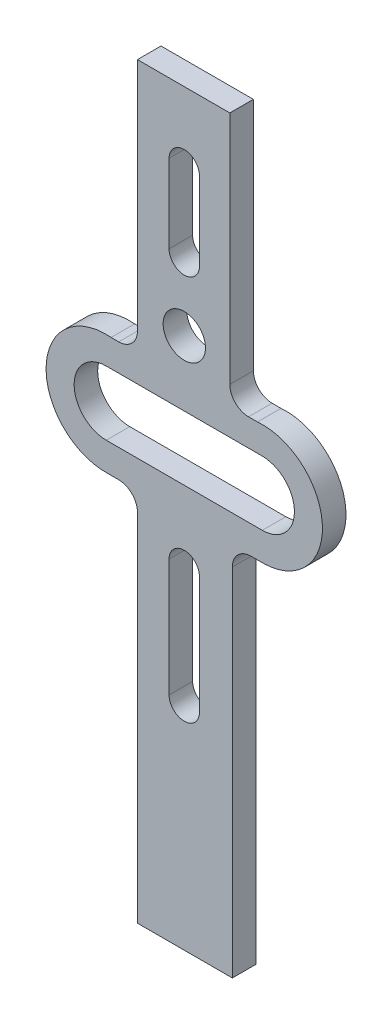
ISO-10303-21;
HEADER;
FILE_DESCRIPTION(('STEP AP214'),'2;1');
FILE_NAME('part.step','',(''),(''),'','','');
FILE_SCHEMA(('AUTOMOTIVE_DESIGN { 1 0 10303 214 1 1 1 1 }'));
ENDSEC;
DATA;
#1=APPLICATION_CONTEXT('core data for automotive mechanical design processes');
#2=APPLICATION_PROTOCOL_DEFINITION('international standard','automotive_design',2000,#1);
#3=PRODUCT_CONTEXT('',#1,'mechanical');
#4=PRODUCT('Part','Part','',(#3));
#5=PRODUCT_RELATED_PRODUCT_CATEGORY('part','',(#4));
#6=PRODUCT_DEFINITION_FORMATION('','',#4);
#7=PRODUCT_DEFINITION_CONTEXT('part definition',#1,'design');
#8=PRODUCT_DEFINITION('design','',#6,#7);
#9=PRODUCT_DEFINITION_SHAPE('','',#8);
#10=(LENGTH_UNIT() NAMED_UNIT(*) SI_UNIT(.MILLI.,.METRE.));
#11=(NAMED_UNIT(*) PLANE_ANGLE_UNIT() SI_UNIT($,.RADIAN.));
#12=(NAMED_UNIT(*) SI_UNIT($,.STERADIAN.) SOLID_ANGLE_UNIT());
#13=UNCERTAINTY_MEASURE_WITH_UNIT(LENGTH_MEASURE(1.E-05),#10,'distance_accuracy_value','');
#14=(GEOMETRIC_REPRESENTATION_CONTEXT(3) GLOBAL_UNCERTAINTY_ASSIGNED_CONTEXT((#13)) GLOBAL_UNIT_ASSIGNED_CONTEXT((#10,
#11,#12)) REPRESENTATION_CONTEXT('',''));
#15=CARTESIAN_POINT('',(0.,0.,0.));
#16=DIRECTION('',(0.,0.,1.));
#17=DIRECTION('',(1.,0.,0.));
#18=AXIS2_PLACEMENT_3D('',#15,#16,#17);
#19=CARTESIAN_POINT('',(0.,0.,2.997));
#20=DIRECTION('',(1.,0.,0.));
#21=DIRECTION('',(0.,0.,-1.));
#22=AXIS2_PLACEMENT_3D('',#19,#20,#21);
#23=PLANE('',#22);
#24=DIRECTION('',(0.,-1.,0.));
#25=VECTOR('',#24,1.);
#26=CARTESIAN_POINT('',(0.,0.,0.));
#27=LINE('',#26,#25);
#28=CARTESIAN_POINT('',(0.,45.311,0.));
#29=VERTEX_POINT('',#28);
#30=CARTESIAN_POINT('',(0.,0.,0.));
#31=VERTEX_POINT('',#30);
#32=EDGE_CURVE('E364',#29,#31,#27,.T.);
#33=ORIENTED_EDGE('',*,*,#32,.T.);
#34=DIRECTION('',(0.,0.,-1.));
#35=VECTOR('',#34,1.);
#36=CARTESIAN_POINT('',(0.,0.,2.997));
#37=LINE('',#36,#35);
#38=CARTESIAN_POINT('',(0.,0.,2.997));
#39=VERTEX_POINT('',#38);
#40=EDGE_CURVE('E11',#39,#31,#37,.T.);
#41=ORIENTED_EDGE('',*,*,#40,.F.);
#42=DIRECTION('',(0.,-1.,0.));
#43=VECTOR('',#42,1.);
#44=CARTESIAN_POINT('',(0.,0.,2.997));
#45=LINE('',#44,#43);
#46=CARTESIAN_POINT('',(0.,45.311,2.997));
#47=VERTEX_POINT('',#46);
#48=EDGE_CURVE('E368',#47,#39,#45,.T.);
#49=ORIENTED_EDGE('',*,*,#48,.F.);
#50=DIRECTION('',(0.,0.,-1.));
#51=VECTOR('',#50,1.);
#52=CARTESIAN_POINT('',(0.,45.311,2.997));
#53=LINE('',#52,#51);
#54=EDGE_CURVE('E418',#47,#29,#53,.T.);
#55=ORIENTED_EDGE('',*,*,#54,.T.);
#56=EDGE_LOOP('',(#33,#41,#49,#55));
#57=FACE_BOUND('',#56,.T.);
#58=ADVANCED_FACE('F39',(#57),#23,.F.);
#59=CARTESIAN_POINT('',(0.,0.,2.997));
#60=DIRECTION('',(0.,1.,0.));
#61=DIRECTION('',(0.,0.,1.));
#62=AXIS2_PLACEMENT_3D('',#59,#60,#61);
#63=PLANE('',#62);
#64=DIRECTION('',(1.,0.,0.));
#65=VECTOR('',#64,1.);
#66=CARTESIAN_POINT('',(0.,0.,0.));
#67=LINE('',#66,#65);
#68=CARTESIAN_POINT('',(12.08,0.,0.));
#69=VERTEX_POINT('',#68);
#70=EDGE_CURVE('E422',#31,#69,#67,.T.);
#71=ORIENTED_EDGE('',*,*,#70,.T.);
#72=DIRECTION('',(0.,0.,-1.));
#73=VECTOR('',#72,1.);
#74=CARTESIAN_POINT('',(12.08,0.,2.997));
#75=LINE('',#74,#73);
#76=CARTESIAN_POINT('',(12.08,0.,2.997));
#77=VERTEX_POINT('',#76);
#78=EDGE_CURVE('E47',#77,#69,#75,.T.);
#79=ORIENTED_EDGE('',*,*,#78,.F.);
#80=DIRECTION('',(1.,0.,0.));
#81=VECTOR('',#80,1.);
#82=CARTESIAN_POINT('',(0.,0.,2.997));
#83=LINE('',#82,#81);
#84=EDGE_CURVE('E372',#39,#77,#83,.T.);
#85=ORIENTED_EDGE('',*,*,#84,.F.);
#86=ORIENTED_EDGE('',*,*,#40,.T.);
#87=EDGE_LOOP('',(#71,#79,#85,#86));
#88=FACE_BOUND('',#87,.T.);
#89=ADVANCED_FACE('F548',(#88),#63,.F.);
#90=CARTESIAN_POINT('',(12.08,0.,2.997));
#91=DIRECTION('',(-1.,0.,0.));
#92=DIRECTION('',(0.,0.,1.));
#93=AXIS2_PLACEMENT_3D('',#90,#91,#92);
#94=PLANE('',#93);
#95=DIRECTION('',(0.,1.,0.));
#96=VECTOR('',#95,1.);
#97=CARTESIAN_POINT('',(12.08,0.,0.));
#98=LINE('',#97,#96);
#99=CARTESIAN_POINT('',(12.08,45.311,0.));
#100=VERTEX_POINT('',#99);
#101=EDGE_CURVE('E425',#69,#100,#98,.T.);
#102=ORIENTED_EDGE('',*,*,#101,.T.);
#103=DIRECTION('',(0.,0.,-1.));
#104=VECTOR('',#103,1.);
#105=CARTESIAN_POINT('',(12.08,45.311,2.997));
#106=LINE('',#105,#104);
#107=CARTESIAN_POINT('',(12.08,45.311,2.997));
#108=VERTEX_POINT('',#107);
#109=EDGE_CURVE('E517',#108,#100,#106,.T.);
#110=ORIENTED_EDGE('',*,*,#109,.F.);
#111=DIRECTION('',(0.,1.,0.));
#112=VECTOR('',#111,1.);
#113=CARTESIAN_POINT('',(12.08,0.,2.997));
#114=LINE('',#113,#112);
#115=EDGE_CURVE('E376',#77,#108,#114,.T.);
#116=ORIENTED_EDGE('',*,*,#115,.F.);
#117=ORIENTED_EDGE('',*,*,#78,.T.);
#118=EDGE_LOOP('',(#102,#110,#116,#117));
#119=FACE_BOUND('',#118,.T.);
#120=ADVANCED_FACE('F526',(#119),#94,.F.);
#121=CARTESIAN_POINT('',(14.461,45.311,2.997));
#122=DIRECTION('',(0.,0.,-1.));
#123=DIRECTION('',(-1.,0.,0.));
#124=AXIS2_PLACEMENT_3D('',#121,#122,#123);
#125=CYLINDRICAL_SURFACE('',#124,2.381);
#126=CARTESIAN_POINT('',(14.461,45.311,0.));
#127=DIRECTION('',(0.,0.,-1.));
#128=DIRECTION('',(1.,0.,0.));
#129=AXIS2_PLACEMENT_3D('',#126,#127,#128);
#130=CIRCLE('',#129,2.381);
#131=CARTESIAN_POINT('',(14.461,47.692,0.));
#132=VERTEX_POINT('',#131);
#133=EDGE_CURVE('E428',#100,#132,#130,.T.);
#134=ORIENTED_EDGE('',*,*,#133,.T.);
#135=DIRECTION('',(0.,0.,-1.));
#136=VECTOR('',#135,1.);
#137=CARTESIAN_POINT('',(14.461,47.692,2.997));
#138=LINE('',#137,#136);
#139=CARTESIAN_POINT('',(14.461,47.692,2.997));
#140=VERTEX_POINT('',#139);
#141=EDGE_CURVE('E513',#140,#132,#138,.T.);
#142=ORIENTED_EDGE('',*,*,#141,.F.);
#143=CARTESIAN_POINT('',(14.461,45.311,2.997));
#144=DIRECTION('',(0.,0.,-1.));
#145=DIRECTION('',(1.,0.,0.));
#146=AXIS2_PLACEMENT_3D('',#143,#144,#145);
#147=CIRCLE('',#146,2.381);
#148=EDGE_CURVE('E379',#108,#140,#147,.T.);
#149=ORIENTED_EDGE('',*,*,#148,.F.);
#150=ORIENTED_EDGE('',*,*,#109,.T.);
#151=EDGE_LOOP('',(#134,#142,#149,#150));
#152=FACE_BOUND('',#151,.T.);
#153=ADVANCED_FACE('F536',(#152),#125,.F.);
#154=CARTESIAN_POINT('',(14.461,47.692,2.997));
#155=DIRECTION('',(0.,1.,0.));
#156=DIRECTION('',(-1.,0.,0.));
#157=AXIS2_PLACEMENT_3D('',#154,#155,#156);
#158=PLANE('',#157);
#159=DIRECTION('',(1.,0.,0.));
#160=VECTOR('',#159,1.);
#161=CARTESIAN_POINT('',(14.461,47.692,0.));
#162=LINE('',#161,#160);
#163=CARTESIAN_POINT('',(16.1394814934354,47.692,0.));
#164=VERTEX_POINT('',#163);
#165=EDGE_CURVE('E431',#132,#164,#162,.T.);
#166=ORIENTED_EDGE('',*,*,#165,.T.);
#167=DIRECTION('',(0.,0.,-1.));
#168=VECTOR('',#167,1.);
#169=CARTESIAN_POINT('',(16.1394814934354,47.692,2.997));
#170=LINE('',#169,#168);
#171=CARTESIAN_POINT('',(16.1394814934354,47.692,2.997));
#172=VERTEX_POINT('',#171);
#173=EDGE_CURVE('E509',#172,#164,#170,.T.);
#174=ORIENTED_EDGE('',*,*,#173,.F.);
#175=DIRECTION('',(1.,0.,0.));
#176=VECTOR('',#175,1.);
#177=CARTESIAN_POINT('',(14.461,47.692,2.997));
#178=LINE('',#177,#176);
#179=EDGE_CURVE('E382',#140,#172,#178,.T.);
#180=ORIENTED_EDGE('',*,*,#179,.F.);
#181=ORIENTED_EDGE('',*,*,#141,.T.);
#182=EDGE_LOOP('',(#166,#174,#180,#181));
#183=FACE_BOUND('',#182,.T.);
#184=ADVANCED_FACE('F540',(#183),#158,.F.);
#185=CARTESIAN_POINT('',(15.928,55.3090647613063,2.997));
#186=DIRECTION('',(0.,0.,-1.));
#187=DIRECTION('',(-1.,0.,0.));
#188=AXIS2_PLACEMENT_3D('',#185,#186,#187);
#189=CYLINDRICAL_SURFACE('',#188,7.62);
#190=CARTESIAN_POINT('',(15.928,55.3090647613063,0.));
#191=DIRECTION('',(0.,0.,1.));
#192=DIRECTION('',(1.,0.,0.));
#193=AXIS2_PLACEMENT_3D('',#190,#191,#192);
#194=CIRCLE('',#193,7.62);
#195=CARTESIAN_POINT('',(15.2753622750715,62.9010647613063,0.));
#196=VERTEX_POINT('',#195);
#197=EDGE_CURVE('E434',#164,#196,#194,.T.);
#198=ORIENTED_EDGE('',*,*,#197,.T.);
#199=DIRECTION('',(0.,0.,-1.));
#200=VECTOR('',#199,1.);
#201=CARTESIAN_POINT('',(15.2753622750715,62.9010647613063,2.997));
#202=LINE('',#201,#200);
#203=CARTESIAN_POINT('',(15.2753622750715,62.9010647613063,2.997));
#204=VERTEX_POINT('',#203);
#205=EDGE_CURVE('E505',#204,#196,#202,.T.);
#206=ORIENTED_EDGE('',*,*,#205,.F.);
#207=CARTESIAN_POINT('',(15.928,55.3090647613063,2.997));
#208=DIRECTION('',(0.,0.,1.));
#209=DIRECTION('',(1.,0.,0.));
#210=AXIS2_PLACEMENT_3D('',#207,#208,#209);
#211=CIRCLE('',#210,7.62);
#212=EDGE_CURVE('E385',#172,#204,#211,.T.);
#213=ORIENTED_EDGE('',*,*,#212,.F.);
#214=ORIENTED_EDGE('',*,*,#173,.T.);
#215=EDGE_LOOP('',(#198,#206,#213,#214));
#216=FACE_BOUND('',#215,.T.);
#217=ADVANCED_FACE('F601',(#216),#189,.T.);
#218=CARTESIAN_POINT('',(14.141,62.9010647613063,2.997));
#219=DIRECTION('',(0.,-1.,0.));
#220=DIRECTION('',(0.,0.,-1.));
#221=AXIS2_PLACEMENT_3D('',#218,#219,#220);
#222=PLANE('',#221);
#223=DIRECTION('',(-1.,0.,0.));
#224=VECTOR('',#223,1.);
#225=CARTESIAN_POINT('',(14.141,62.9010647613063,0.));
#226=LINE('',#225,#224);
#227=CARTESIAN_POINT('',(14.141,62.9010647613063,0.));
#228=VERTEX_POINT('',#227);
#229=EDGE_CURVE('E437',#196,#228,#226,.T.);
#230=ORIENTED_EDGE('',*,*,#229,.T.);
#231=DIRECTION('',(0.,0.,-1.));
#232=VECTOR('',#231,1.);
#233=CARTESIAN_POINT('',(14.141,62.9010647613063,2.997));
#234=LINE('',#233,#232);
#235=CARTESIAN_POINT('',(14.141,62.9010647613063,2.997));
#236=VERTEX_POINT('',#235);
#237=EDGE_CURVE('E501',#236,#228,#234,.T.);
#238=ORIENTED_EDGE('',*,*,#237,.F.);
#239=DIRECTION('',(-1.,0.,0.));
#240=VECTOR('',#239,1.);
#241=CARTESIAN_POINT('',(14.141,62.9010647613063,2.997));
#242=LINE('',#241,#240);
#243=EDGE_CURVE('E388',#204,#236,#242,.T.);
#244=ORIENTED_EDGE('',*,*,#243,.F.);
#245=ORIENTED_EDGE('',*,*,#205,.T.);
#246=EDGE_LOOP('',(#230,#238,#244,#245));
#247=FACE_BOUND('',#246,.T.);
#248=ADVANCED_FACE('F598',(#247),#222,.F.);
#249=CARTESIAN_POINT('',(14.141,65.2820647613063,2.997));
#250=DIRECTION('',(0.,0.,-1.));
#251=DIRECTION('',(-1.,0.,0.));
#252=AXIS2_PLACEMENT_3D('',#249,#250,#251);
#253=CYLINDRICAL_SURFACE('',#252,2.381);
#254=CARTESIAN_POINT('',(14.141,65.2820647613063,0.));
#255=DIRECTION('',(0.,0.,-1.));
#256=DIRECTION('',(1.,0.,0.));
#257=AXIS2_PLACEMENT_3D('',#254,#255,#256);
#258=CIRCLE('',#257,2.381);
#259=CARTESIAN_POINT('',(11.76,65.2820647613063,0.));
#260=VERTEX_POINT('',#259);
#261=EDGE_CURVE('E440',#228,#260,#258,.T.);
#262=ORIENTED_EDGE('',*,*,#261,.T.);
#263=DIRECTION('',(0.,0.,-1.));
#264=VECTOR('',#263,1.);
#265=CARTESIAN_POINT('',(11.76,65.2820647613063,2.997));
#266=LINE('',#265,#264);
#267=CARTESIAN_POINT('',(11.76,65.2820647613063,2.997));
#268=VERTEX_POINT('',#267);
#269=EDGE_CURVE('E497',#268,#260,#266,.T.);
#270=ORIENTED_EDGE('',*,*,#269,.F.);
#271=CARTESIAN_POINT('',(14.141,65.2820647613063,2.997));
#272=DIRECTION('',(0.,0.,-1.));
#273=DIRECTION('',(1.,0.,0.));
#274=AXIS2_PLACEMENT_3D('',#271,#272,#273);
#275=CIRCLE('',#274,2.381);
#276=EDGE_CURVE('E391',#236,#268,#275,.T.);
#277=ORIENTED_EDGE('',*,*,#276,.F.);
#278=ORIENTED_EDGE('',*,*,#237,.T.);
#279=EDGE_LOOP('',(#262,#270,#277,#278));
#280=FACE_BOUND('',#279,.T.);
#281=ADVANCED_FACE('F594',(#280),#253,.F.);
#282=CARTESIAN_POINT('',(11.76,95.2090647613063,2.997));
#283=DIRECTION('',(-1.,0.,0.));
#284=DIRECTION('',(0.,-1.,0.));
#285=AXIS2_PLACEMENT_3D('',#282,#283,#284);
#286=PLANE('',#285);
#287=DIRECTION('',(0.,1.,0.));
#288=VECTOR('',#287,1.);
#289=CARTESIAN_POINT('',(11.76,95.2090647613063,0.));
#290=LINE('',#289,#288);
#291=CARTESIAN_POINT('',(11.76,95.2090647613063,0.));
#292=VERTEX_POINT('',#291);
#293=EDGE_CURVE('E443',#260,#292,#290,.T.);
#294=ORIENTED_EDGE('',*,*,#293,.T.);
#295=DIRECTION('',(0.,0.,-1.));
#296=VECTOR('',#295,1.);
#297=CARTESIAN_POINT('',(11.76,95.2090647613063,2.997));
#298=LINE('',#297,#296);
#299=CARTESIAN_POINT('',(11.76,95.2090647613063,2.997));
#300=VERTEX_POINT('',#299);
#301=EDGE_CURVE('E493',#300,#292,#298,.T.);
#302=ORIENTED_EDGE('',*,*,#301,.F.);
#303=DIRECTION('',(0.,1.,0.));
#304=VECTOR('',#303,1.);
#305=CARTESIAN_POINT('',(11.76,95.2090647613063,2.997));
#306=LINE('',#305,#304);
#307=EDGE_CURVE('E394',#268,#300,#306,.T.);
#308=ORIENTED_EDGE('',*,*,#307,.F.);
#309=ORIENTED_EDGE('',*,*,#269,.T.);
#310=EDGE_LOOP('',(#294,#302,#308,#309));
#311=FACE_BOUND('',#310,.T.);
#312=ADVANCED_FACE('F590',(#311),#286,.F.);
#313=CARTESIAN_POINT('',(0.,95.2090647613063,2.997));
#314=DIRECTION('',(0.,-1.,0.));
#315=DIRECTION('',(1.,0.,0.));
#316=AXIS2_PLACEMENT_3D('',#313,#314,#315);
#317=PLANE('',#316);
#318=DIRECTION('',(-1.,0.,0.));
#319=VECTOR('',#318,1.);
#320=CARTESIAN_POINT('',(0.,95.2090647613063,0.));
#321=LINE('',#320,#319);
#322=CARTESIAN_POINT('',(0.,95.2090647613063,0.));
#323=VERTEX_POINT('',#322);
#324=EDGE_CURVE('E446',#292,#323,#321,.T.);
#325=ORIENTED_EDGE('',*,*,#324,.T.);
#326=DIRECTION('',(0.,0.,-1.));
#327=VECTOR('',#326,1.);
#328=CARTESIAN_POINT('',(0.,95.2090647613063,2.997));
#329=LINE('',#328,#327);
#330=CARTESIAN_POINT('',(0.,95.2090647613063,2.997));
#331=VERTEX_POINT('',#330);
#332=EDGE_CURVE('E489',#331,#323,#329,.T.);
#333=ORIENTED_EDGE('',*,*,#332,.F.);
#334=DIRECTION('',(-1.,0.,0.));
#335=VECTOR('',#334,1.);
#336=CARTESIAN_POINT('',(0.,95.2090647613063,2.997));
#337=LINE('',#336,#335);
#338=EDGE_CURVE('E397',#300,#331,#337,.T.);
#339=ORIENTED_EDGE('',*,*,#338,.F.);
#340=ORIENTED_EDGE('',*,*,#301,.T.);
#341=EDGE_LOOP('',(#325,#333,#339,#340));
#342=FACE_BOUND('',#341,.T.);
#343=ADVANCED_FACE('F585',(#342),#317,.F.);
#344=CARTESIAN_POINT('',(0.,95.2090647613063,2.997));
#345=DIRECTION('',(1.,0.,0.));
#346=DIRECTION('',(0.,1.,0.));
#347=AXIS2_PLACEMENT_3D('',#344,#345,#346);
#348=PLANE('',#347);
#349=DIRECTION('',(0.,-1.,0.));
#350=VECTOR('',#349,1.);
#351=CARTESIAN_POINT('',(0.,95.2090647613063,0.));
#352=LINE('',#351,#350);
#353=CARTESIAN_POINT('',(0.,65.2820647613063,0.));
#354=VERTEX_POINT('',#353);
#355=EDGE_CURVE('E449',#323,#354,#352,.T.);
#356=ORIENTED_EDGE('',*,*,#355,.T.);
#357=DIRECTION('',(0.,0.,-1.));
#358=VECTOR('',#357,1.);
#359=CARTESIAN_POINT('',(0.,65.2820647613063,2.997));
#360=LINE('',#359,#358);
#361=CARTESIAN_POINT('',(0.,65.2820647613063,2.997));
#362=VERTEX_POINT('',#361);
#363=EDGE_CURVE('E485',#362,#354,#360,.T.);
#364=ORIENTED_EDGE('',*,*,#363,.F.);
#365=DIRECTION('',(0.,-1.,0.));
#366=VECTOR('',#365,1.);
#367=CARTESIAN_POINT('',(0.,95.2090647613063,2.997));
#368=LINE('',#367,#366);
#369=EDGE_CURVE('E400',#331,#362,#368,.T.);
#370=ORIENTED_EDGE('',*,*,#369,.F.);
#371=ORIENTED_EDGE('',*,*,#332,.T.);
#372=EDGE_LOOP('',(#356,#364,#370,#371));
#373=FACE_BOUND('',#372,.T.);
#374=ADVANCED_FACE('F579',(#373),#348,.F.);
#375=CARTESIAN_POINT('',(-2.381,65.2820647613063,2.997));
#376=DIRECTION('',(0.,0.,-1.));
#377=DIRECTION('',(-1.,0.,0.));
#378=AXIS2_PLACEMENT_3D('',#375,#376,#377);
#379=CYLINDRICAL_SURFACE('',#378,2.381);
#380=CARTESIAN_POINT('',(-2.381,65.2820647613063,0.));
#381=DIRECTION('',(0.,0.,-1.));
#382=DIRECTION('',(1.,0.,0.));
#383=AXIS2_PLACEMENT_3D('',#380,#381,#382);
#384=CIRCLE('',#383,2.381);
#385=CARTESIAN_POINT('',(-2.381,62.9010647613063,0.));
#386=VERTEX_POINT('',#385);
#387=EDGE_CURVE('E452',#354,#386,#384,.T.);
#388=ORIENTED_EDGE('',*,*,#387,.T.);
#389=DIRECTION('',(0.,0.,-1.));
#390=VECTOR('',#389,1.);
#391=CARTESIAN_POINT('',(-2.381,62.9010647613063,2.997));
#392=LINE('',#391,#390);
#393=CARTESIAN_POINT('',(-2.381,62.9010647613063,2.997));
#394=VERTEX_POINT('',#393);
#395=EDGE_CURVE('E481',#394,#386,#392,.T.);
#396=ORIENTED_EDGE('',*,*,#395,.F.);
#397=CARTESIAN_POINT('',(-2.381,65.2820647613063,2.997));
#398=DIRECTION('',(0.,0.,-1.));
#399=DIRECTION('',(1.,0.,0.));
#400=AXIS2_PLACEMENT_3D('',#397,#398,#399);
#401=CIRCLE('',#400,2.381);
#402=EDGE_CURVE('E403',#362,#394,#401,.T.);
#403=ORIENTED_EDGE('',*,*,#402,.F.);
#404=ORIENTED_EDGE('',*,*,#363,.T.);
#405=EDGE_LOOP('',(#388,#396,#403,#404));
#406=FACE_BOUND('',#405,.T.);
#407=ADVANCED_FACE('F575',(#406),#379,.F.);
#408=CARTESIAN_POINT('',(-3.35836227507132,62.9010647613063,2.997));
#409=DIRECTION('',(0.,-1.,0.));
#410=DIRECTION('',(0.,0.,-1.));
#411=AXIS2_PLACEMENT_3D('',#408,#409,#410);
#412=PLANE('',#411);
#413=DIRECTION('',(-1.,0.,0.));
#414=VECTOR('',#413,1.);
#415=CARTESIAN_POINT('',(-3.35836227507132,62.9010647613063,0.));
#416=LINE('',#415,#414);
#417=CARTESIAN_POINT('',(-3.35836227507132,62.9010647613063,0.));
#418=VERTEX_POINT('',#417);
#419=EDGE_CURVE('E455',#386,#418,#416,.T.);
#420=ORIENTED_EDGE('',*,*,#419,.T.);
#421=DIRECTION('',(0.,0.,-1.));
#422=VECTOR('',#421,1.);
#423=CARTESIAN_POINT('',(-3.35836227507132,62.9010647613063,2.997));
#424=LINE('',#423,#422);
#425=CARTESIAN_POINT('',(-3.35836227507132,62.9010647613063,2.997));
#426=VERTEX_POINT('',#425);
#427=EDGE_CURVE('E477',#426,#418,#424,.T.);
#428=ORIENTED_EDGE('',*,*,#427,.F.);
#429=DIRECTION('',(-1.,0.,0.));
#430=VECTOR('',#429,1.);
#431=CARTESIAN_POINT('',(-3.35836227507132,62.9010647613063,2.997));
#432=LINE('',#431,#430);
#433=EDGE_CURVE('E406',#394,#426,#432,.T.);
#434=ORIENTED_EDGE('',*,*,#433,.F.);
#435=ORIENTED_EDGE('',*,*,#395,.T.);
#436=EDGE_LOOP('',(#420,#428,#434,#435));
#437=FACE_BOUND('',#436,.T.);
#438=ADVANCED_FACE('F570',(#437),#412,.F.);
#439=CARTESIAN_POINT('',(-4.011,55.3090647613063,2.997));
#440=DIRECTION('',(0.,0.,-1.));
#441=DIRECTION('',(-1.,0.,0.));
#442=AXIS2_PLACEMENT_3D('',#439,#440,#441);
#443=CYLINDRICAL_SURFACE('',#442,7.62);
#444=CARTESIAN_POINT('',(-4.011,55.3090647613063,0.));
#445=DIRECTION('',(0.,0.,1.));
#446=DIRECTION('',(1.,0.,0.));
#447=AXIS2_PLACEMENT_3D('',#444,#445,#446);
#448=CIRCLE('',#447,7.62);
#449=CARTESIAN_POINT('',(-3.79951850656438,47.692,0.));
#450=VERTEX_POINT('',#449);
#451=EDGE_CURVE('E458',#418,#450,#448,.T.);
#452=ORIENTED_EDGE('',*,*,#451,.T.);
#453=DIRECTION('',(0.,0.,-1.));
#454=VECTOR('',#453,1.);
#455=CARTESIAN_POINT('',(-3.79951850656438,47.692,2.997));
#456=LINE('',#455,#454);
#457=CARTESIAN_POINT('',(-3.79951850656438,47.692,2.997));
#458=VERTEX_POINT('',#457);
#459=EDGE_CURVE('E473',#458,#450,#456,.T.);
#460=ORIENTED_EDGE('',*,*,#459,.F.);
#461=CARTESIAN_POINT('',(-4.011,55.3090647613063,2.997));
#462=DIRECTION('',(0.,0.,1.));
#463=DIRECTION('',(1.,0.,0.));
#464=AXIS2_PLACEMENT_3D('',#461,#462,#463);
#465=CIRCLE('',#464,7.62);
#466=EDGE_CURVE('E409',#426,#458,#465,.T.);
#467=ORIENTED_EDGE('',*,*,#466,.F.);
#468=ORIENTED_EDGE('',*,*,#427,.T.);
#469=EDGE_LOOP('',(#452,#460,#467,#468));
#470=FACE_BOUND('',#469,.T.);
#471=ADVANCED_FACE('F564',(#470),#443,.T.);
#472=CARTESIAN_POINT('',(-3.79951850656438,47.692,2.997));
#473=DIRECTION('',(0.,1.,0.));
#474=DIRECTION('',(0.,0.,1.));
#475=AXIS2_PLACEMENT_3D('',#472,#473,#474);
#476=PLANE('',#475);
#477=DIRECTION('',(1.,0.,0.));
#478=VECTOR('',#477,1.);
#479=CARTESIAN_POINT('',(-3.79951850656438,47.692,0.));
#480=LINE('',#479,#478);
#481=CARTESIAN_POINT('',(-2.381,47.692,0.));
#482=VERTEX_POINT('',#481);
#483=EDGE_CURVE('E461',#450,#482,#480,.T.);
#484=ORIENTED_EDGE('',*,*,#483,.T.);
#485=DIRECTION('',(0.,0.,-1.));
#486=VECTOR('',#485,1.);
#487=CARTESIAN_POINT('',(-2.381,47.692,2.997));
#488=LINE('',#487,#486);
#489=CARTESIAN_POINT('',(-2.381,47.692,2.997));
#490=VERTEX_POINT('',#489);
#491=EDGE_CURVE('E469',#490,#482,#488,.T.);
#492=ORIENTED_EDGE('',*,*,#491,.F.);
#493=DIRECTION('',(1.,0.,0.));
#494=VECTOR('',#493,1.);
#495=CARTESIAN_POINT('',(-3.79951850656438,47.692,2.997));
#496=LINE('',#495,#494);
#497=EDGE_CURVE('E412',#458,#490,#496,.T.);
#498=ORIENTED_EDGE('',*,*,#497,.F.);
#499=ORIENTED_EDGE('',*,*,#459,.T.);
#500=EDGE_LOOP('',(#484,#492,#498,#499));
#501=FACE_BOUND('',#500,.T.);
#502=ADVANCED_FACE('F560',(#501),#476,.F.);
#503=CARTESIAN_POINT('',(-2.381,45.311,2.997));
#504=DIRECTION('',(0.,0.,-1.));
#505=DIRECTION('',(-1.,0.,0.));
#506=AXIS2_PLACEMENT_3D('',#503,#504,#505);
#507=CYLINDRICAL_SURFACE('',#506,2.381);
#508=CARTESIAN_POINT('',(-2.381,45.311,0.));
#509=DIRECTION('',(0.,0.,-1.));
#510=DIRECTION('',(1.,0.,0.));
#511=AXIS2_PLACEMENT_3D('',#508,#509,#510);
#512=CIRCLE('',#511,2.381);
#513=EDGE_CURVE('E373',#482,#29,#512,.T.);
#514=ORIENTED_EDGE('',*,*,#513,.T.);
#515=ORIENTED_EDGE('',*,*,#54,.F.);
#516=CARTESIAN_POINT('',(-2.381,45.311,2.997));
#517=DIRECTION('',(0.,0.,-1.));
#518=DIRECTION('',(1.,0.,0.));
#519=AXIS2_PLACEMENT_3D('',#516,#517,#518);
#520=CIRCLE('',#519,2.381);
#521=EDGE_CURVE('E415',#490,#47,#520,.T.);
#522=ORIENTED_EDGE('',*,*,#521,.F.);
#523=ORIENTED_EDGE('',*,*,#491,.T.);
#524=EDGE_LOOP('',(#514,#515,#522,#523));
#525=FACE_BOUND('',#524,.T.);
#526=ADVANCED_FACE('F555',(#525),#507,.F.);
#527=CARTESIAN_POINT('',(-2.381,45.311,2.997));
#528=DIRECTION('',(0.,0.,1.));
#529=DIRECTION('',(1.,0.,0.));
#530=AXIS2_PLACEMENT_3D('',#527,#528,#529);
#531=PLANE('',#530);
#532=CARTESIAN_POINT('',(5.95849999999999,42.164,2.997));
#533=DIRECTION('',(0.,0.,1.));
#534=DIRECTION('',(1.,0.,0.));
#535=AXIS2_PLACEMENT_3D('',#532,#533,#534);
#536=CIRCLE('',#535,1.9305);
#537=CARTESIAN_POINT('',(7.88899999999999,42.164,2.997));
#538=VERTEX_POINT('',#537);
#539=CARTESIAN_POINT('',(4.028,42.164,2.997));
#540=VERTEX_POINT('',#539);
#541=EDGE_CURVE('E54',#538,#540,#536,.T.);
#542=ORIENTED_EDGE('',*,*,#541,.F.);
#543=DIRECTION('',(0.,1.,0.));
#544=VECTOR('',#543,1.);
#545=CARTESIAN_POINT('',(7.88899999999999,42.164,2.997));
#546=LINE('',#545,#544);
#547=CARTESIAN_POINT('',(7.88899999999999,27.178,2.997));
#548=VERTEX_POINT('',#547);
#549=EDGE_CURVE('E245',#548,#538,#546,.T.);
#550=ORIENTED_EDGE('',*,*,#549,.F.);
#551=CARTESIAN_POINT('',(5.95850000000007,27.178,2.997));
#552=DIRECTION('',(0.,0.,1.));
#553=DIRECTION('',(1.,0.,0.));
#554=AXIS2_PLACEMENT_3D('',#551,#552,#553);
#555=CIRCLE('',#554,1.9305);
#556=CARTESIAN_POINT('',(4.02800000000008,27.178,2.997));
#557=VERTEX_POINT('',#556);
#558=EDGE_CURVE('E249',#557,#548,#555,.T.);
#559=ORIENTED_EDGE('',*,*,#558,.F.);
#560=DIRECTION('',(0.,-1.,0.));
#561=VECTOR('',#560,1.);
#562=CARTESIAN_POINT('',(4.02799999999999,42.164,2.997));
#563=LINE('',#562,#561);
#564=EDGE_CURVE('E258',#540,#557,#563,.T.);
#565=ORIENTED_EDGE('',*,*,#564,.F.);
#566=EDGE_LOOP('',(#542,#550,#559,#565));
#567=FACE_BOUND('',#566,.T.);
#568=CARTESIAN_POINT('',(5.95850000000001,86.3440647613063,2.997));
#569=DIRECTION('',(0.,0.,1.));
#570=DIRECTION('',(1.,0.,0.));
#571=AXIS2_PLACEMENT_3D('',#568,#569,#570);
#572=CIRCLE('',#571,1.9305);
#573=CARTESIAN_POINT('',(7.88900000000001,86.3440647613063,2.997));
#574=VERTEX_POINT('',#573);
#575=CARTESIAN_POINT('',(4.02800000000001,86.3440647613063,2.997));
#576=VERTEX_POINT('',#575);
#577=EDGE_CURVE('E267',#574,#576,#572,.T.);
#578=ORIENTED_EDGE('',*,*,#577,.F.);
#579=DIRECTION('',(0.,-1.,0.));
#580=VECTOR('',#579,1.);
#581=CARTESIAN_POINT('',(7.88900000000001,86.3440647613063,2.997));
#582=LINE('',#581,#580);
#583=CARTESIAN_POINT('',(7.88900000000001,76.3620647613063,2.997));
#584=VERTEX_POINT('',#583);
#585=EDGE_CURVE('E278',#574,#584,#582,.T.);
#586=ORIENTED_EDGE('',*,*,#585,.T.);
#587=CARTESIAN_POINT('',(5.95850000000001,76.3620647613063,2.997));
#588=DIRECTION('',(0.,0.,1.));
#589=DIRECTION('',(1.,0.,0.));
#590=AXIS2_PLACEMENT_3D('',#587,#588,#589);
#591=CIRCLE('',#590,1.9305);
#592=CARTESIAN_POINT('',(4.02800000000001,76.3620647613063,2.997));
#593=VERTEX_POINT('',#592);
#594=EDGE_CURVE('E296',#593,#584,#591,.T.);
#595=ORIENTED_EDGE('',*,*,#594,.F.);
#596=DIRECTION('',(0.,-1.,0.));
#597=VECTOR('',#596,1.);
#598=CARTESIAN_POINT('',(4.02800000000001,86.3440647613063,2.997));
#599=LINE('',#598,#597);
#600=EDGE_CURVE('E292',#576,#593,#599,.T.);
#601=ORIENTED_EDGE('',*,*,#600,.F.);
#602=EDGE_LOOP('',(#578,#586,#595,#601));
#603=FACE_BOUND('',#602,.T.);
#604=CARTESIAN_POINT('',(-3.97087675784489,55.3515,2.997));
#605=DIRECTION('',(0.,0.,1.));
#606=DIRECTION('',(1.,0.,0.));
#607=AXIS2_PLACEMENT_3D('',#604,#605,#606);
#608=CIRCLE('',#607,4.0895);
#609=CARTESIAN_POINT('',(-3.97087675784489,59.441,2.997));
#610=VERTEX_POINT('',#609);
#611=CARTESIAN_POINT('',(-3.97087675784489,51.262,2.997));
#612=VERTEX_POINT('',#611);
#613=EDGE_CURVE('E306',#610,#612,#608,.T.);
#614=ORIENTED_EDGE('',*,*,#613,.F.);
#615=DIRECTION('',(-1.,0.,0.));
#616=VECTOR('',#615,1.);
#617=CARTESIAN_POINT('',(-3.97087675784489,59.441,2.997));
#618=LINE('',#617,#616);
#619=CARTESIAN_POINT('',(15.8901232421551,59.441,2.997));
#620=VERTEX_POINT('',#619);
#621=EDGE_CURVE('E321',#620,#610,#618,.T.);
#622=ORIENTED_EDGE('',*,*,#621,.F.);
#623=CARTESIAN_POINT('',(15.8901232421551,55.3515,2.997));
#624=DIRECTION('',(0.,0.,1.));
#625=DIRECTION('',(1.,0.,0.));
#626=AXIS2_PLACEMENT_3D('',#623,#624,#625);
#627=CIRCLE('',#626,4.0895);
#628=CARTESIAN_POINT('',(15.8901232421551,51.262,2.997));
#629=VERTEX_POINT('',#628);
#630=EDGE_CURVE('E340',#629,#620,#627,.T.);
#631=ORIENTED_EDGE('',*,*,#630,.F.);
#632=DIRECTION('',(1.,0.,0.));
#633=VECTOR('',#632,1.);
#634=CARTESIAN_POINT('',(-3.97087675784489,51.262,2.997));
#635=LINE('',#634,#633);
#636=EDGE_CURVE('E336',#612,#629,#635,.T.);
#637=ORIENTED_EDGE('',*,*,#636,.F.);
#638=EDGE_LOOP('',(#614,#622,#631,#637));
#639=FACE_BOUND('',#638,.T.);
#640=CARTESIAN_POINT('',(5.95899999999999,67.7260647613063,2.997));
#641=DIRECTION('',(0.,0.,1.));
#642=DIRECTION('',(1.,0.,0.));
#643=AXIS2_PLACEMENT_3D('',#640,#641,#642);
#644=CIRCLE('',#643,2.6925);
#645=CARTESIAN_POINT('',(8.65149999999999,67.7260647613063,2.997));
#646=VERTEX_POINT('',#645);
#647=EDGE_CURVE('E350',#646,#646,#644,.T.);
#648=ORIENTED_EDGE('',*,*,#647,.F.);
#649=EDGE_LOOP('',(#648));
#650=FACE_BOUND('',#649,.T.);
#651=ORIENTED_EDGE('',*,*,#48,.T.);
#652=ORIENTED_EDGE('',*,*,#84,.T.);
#653=ORIENTED_EDGE('',*,*,#115,.T.);
#654=ORIENTED_EDGE('',*,*,#148,.T.);
#655=ORIENTED_EDGE('',*,*,#179,.T.);
#656=ORIENTED_EDGE('',*,*,#212,.T.);
#657=ORIENTED_EDGE('',*,*,#243,.T.);
#658=ORIENTED_EDGE('',*,*,#276,.T.);
#659=ORIENTED_EDGE('',*,*,#307,.T.);
#660=ORIENTED_EDGE('',*,*,#338,.T.);
#661=ORIENTED_EDGE('',*,*,#369,.T.);
#662=ORIENTED_EDGE('',*,*,#402,.T.);
#663=ORIENTED_EDGE('',*,*,#433,.T.);
#664=ORIENTED_EDGE('',*,*,#466,.T.);
#665=ORIENTED_EDGE('',*,*,#497,.T.);
#666=ORIENTED_EDGE('',*,*,#521,.T.);
#667=EDGE_LOOP('',(#651,#652,#653,#654,#655,#656,#657,#658,#659,#660,#661,#662,#663,#664,#665,#666));
#668=FACE_BOUND('',#667,.T.);
#669=ADVANCED_FACE('F544',(#567,#603,#639,#650,#668),#531,.T.);
#670=CARTESIAN_POINT('',(-2.381,45.311,0.));
#671=DIRECTION('',(0.,0.,1.));
#672=DIRECTION('',(1.,0.,0.));
#673=AXIS2_PLACEMENT_3D('',#670,#671,#672);
#674=PLANE('',#673);
#675=DIRECTION('',(0.,1.,0.));
#676=VECTOR('',#675,1.);
#677=CARTESIAN_POINT('',(7.88899999999999,42.164,0.));
#678=LINE('',#677,#676);
#679=CARTESIAN_POINT('',(7.88899999999999,27.178,0.));
#680=VERTEX_POINT('',#679);
#681=CARTESIAN_POINT('',(7.88899999999999,42.164,0.));
#682=VERTEX_POINT('',#681);
#683=EDGE_CURVE('E233',#680,#682,#678,.T.);
#684=ORIENTED_EDGE('',*,*,#683,.T.);
#685=CARTESIAN_POINT('',(5.95849999999999,42.164,0.));
#686=DIRECTION('',(0.,0.,1.));
#687=DIRECTION('',(1.,0.,0.));
#688=AXIS2_PLACEMENT_3D('',#685,#686,#687);
#689=CIRCLE('',#688,1.9305);
#690=CARTESIAN_POINT('',(4.02799999999999,42.164,0.));
#691=VERTEX_POINT('',#690);
#692=EDGE_CURVE('E226',#682,#691,#689,.T.);
#693=ORIENTED_EDGE('',*,*,#692,.T.);
#694=DIRECTION('',(0.,-1.,0.));
#695=VECTOR('',#694,1.);
#696=CARTESIAN_POINT('',(4.02799999999999,42.164,0.));
#697=LINE('',#696,#695);
#698=CARTESIAN_POINT('',(4.028,27.178,0.));
#699=VERTEX_POINT('',#698);
#700=EDGE_CURVE('E236',#691,#699,#697,.T.);
#701=ORIENTED_EDGE('',*,*,#700,.T.);
#702=CARTESIAN_POINT('',(5.95850000000007,27.178,0.));
#703=DIRECTION('',(0.,0.,1.));
#704=DIRECTION('',(1.,0.,0.));
#705=AXIS2_PLACEMENT_3D('',#702,#703,#704);
#706=CIRCLE('',#705,1.9305);
#707=EDGE_CURVE('E62',#699,#680,#706,.T.);
#708=ORIENTED_EDGE('',*,*,#707,.T.);
#709=EDGE_LOOP('',(#684,#693,#701,#708));
#710=FACE_BOUND('',#709,.T.);
#711=DIRECTION('',(0.,-1.,0.));
#712=VECTOR('',#711,1.);
#713=CARTESIAN_POINT('',(7.88900000000001,86.3440647613063,0.));
#714=LINE('',#713,#712);
#715=CARTESIAN_POINT('',(7.88900000000001,86.3440647613063,0.));
#716=VERTEX_POINT('',#715);
#717=CARTESIAN_POINT('',(7.88900000000001,76.3620647613063,0.));
#718=VERTEX_POINT('',#717);
#719=EDGE_CURVE('E286',#716,#718,#714,.T.);
#720=ORIENTED_EDGE('',*,*,#719,.F.);
#721=CARTESIAN_POINT('',(5.95850000000001,86.3440647613063,0.));
#722=DIRECTION('',(0.,0.,1.));
#723=DIRECTION('',(1.,0.,0.));
#724=AXIS2_PLACEMENT_3D('',#721,#722,#723);
#725=CIRCLE('',#724,1.9305);
#726=CARTESIAN_POINT('',(4.02800000000001,86.3440647613063,0.));
#727=VERTEX_POINT('',#726);
#728=EDGE_CURVE('E273',#716,#727,#725,.T.);
#729=ORIENTED_EDGE('',*,*,#728,.T.);
#730=DIRECTION('',(0.,-1.,0.));
#731=VECTOR('',#730,1.);
#732=CARTESIAN_POINT('',(4.02800000000001,86.3440647613063,0.));
#733=LINE('',#732,#731);
#734=CARTESIAN_POINT('',(4.02800000000001,76.3620647613063,0.));
#735=VERTEX_POINT('',#734);
#736=EDGE_CURVE('E277',#727,#735,#733,.T.);
#737=ORIENTED_EDGE('',*,*,#736,.T.);
#738=CARTESIAN_POINT('',(5.95850000000001,76.3620647613063,0.));
#739=DIRECTION('',(0.,0.,1.));
#740=DIRECTION('',(1.,0.,0.));
#741=AXIS2_PLACEMENT_3D('',#738,#739,#740);
#742=CIRCLE('',#741,1.9305);
#743=EDGE_CURVE('E282',#735,#718,#742,.T.);
#744=ORIENTED_EDGE('',*,*,#743,.T.);
#745=EDGE_LOOP('',(#720,#729,#737,#744));
#746=FACE_BOUND('',#745,.T.);
#747=DIRECTION('',(-1.,0.,0.));
#748=VECTOR('',#747,1.);
#749=CARTESIAN_POINT('',(-3.97087675784489,59.441,0.));
#750=LINE('',#749,#748);
#751=CARTESIAN_POINT('',(15.8901232421551,59.441,0.));
#752=VERTEX_POINT('',#751);
#753=CARTESIAN_POINT('',(-3.97087675784489,59.441,0.));
#754=VERTEX_POINT('',#753);
#755=EDGE_CURVE('E329',#752,#754,#750,.T.);
#756=ORIENTED_EDGE('',*,*,#755,.T.);
#757=CARTESIAN_POINT('',(-3.97087675784489,55.3515,0.));
#758=DIRECTION('',(0.,0.,1.));
#759=DIRECTION('',(1.,0.,0.));
#760=AXIS2_PLACEMENT_3D('',#757,#758,#759);
#761=CIRCLE('',#760,4.0895);
#762=CARTESIAN_POINT('',(-3.97087675784489,51.262,0.));
#763=VERTEX_POINT('',#762);
#764=EDGE_CURVE('E316',#754,#763,#761,.T.);
#765=ORIENTED_EDGE('',*,*,#764,.T.);
#766=DIRECTION('',(1.,0.,0.));
#767=VECTOR('',#766,1.);
#768=CARTESIAN_POINT('',(-3.97087675784489,51.262,0.));
#769=LINE('',#768,#767);
#770=CARTESIAN_POINT('',(15.8901232421551,51.262,0.));
#771=VERTEX_POINT('',#770);
#772=EDGE_CURVE('E320',#763,#771,#769,.T.);
#773=ORIENTED_EDGE('',*,*,#772,.T.);
#774=CARTESIAN_POINT('',(15.8901232421551,55.3515,0.));
#775=DIRECTION('',(0.,0.,1.));
#776=DIRECTION('',(1.,0.,0.));
#777=AXIS2_PLACEMENT_3D('',#774,#775,#776);
#778=CIRCLE('',#777,4.0895);
#779=EDGE_CURVE('E325',#771,#752,#778,.T.);
#780=ORIENTED_EDGE('',*,*,#779,.T.);
#781=EDGE_LOOP('',(#756,#765,#773,#780));
#782=FACE_BOUND('',#781,.T.);
#783=CARTESIAN_POINT('',(5.95899999999999,67.7260647613063,0.));
#784=DIRECTION('',(0.,0.,1.));
#785=DIRECTION('',(1.,0.,0.));
#786=AXIS2_PLACEMENT_3D('',#783,#784,#785);
#787=CIRCLE('',#786,2.6925);
#788=CARTESIAN_POINT('',(8.65149999999999,67.7260647613063,0.));
#789=VERTEX_POINT('',#788);
#790=EDGE_CURVE('E360',#789,#789,#787,.T.);
#791=ORIENTED_EDGE('',*,*,#790,.T.);
#792=EDGE_LOOP('',(#791));
#793=FACE_BOUND('',#792,.T.);
#794=ORIENTED_EDGE('',*,*,#32,.F.);
#795=ORIENTED_EDGE('',*,*,#513,.F.);
#796=ORIENTED_EDGE('',*,*,#483,.F.);
#797=ORIENTED_EDGE('',*,*,#451,.F.);
#798=ORIENTED_EDGE('',*,*,#419,.F.);
#799=ORIENTED_EDGE('',*,*,#387,.F.);
#800=ORIENTED_EDGE('',*,*,#355,.F.);
#801=ORIENTED_EDGE('',*,*,#324,.F.);
#802=ORIENTED_EDGE('',*,*,#293,.F.);
#803=ORIENTED_EDGE('',*,*,#261,.F.);
#804=ORIENTED_EDGE('',*,*,#229,.F.);
#805=ORIENTED_EDGE('',*,*,#197,.F.);
#806=ORIENTED_EDGE('',*,*,#165,.F.);
#807=ORIENTED_EDGE('',*,*,#133,.F.);
#808=ORIENTED_EDGE('',*,*,#101,.F.);
#809=ORIENTED_EDGE('',*,*,#70,.F.);
#810=EDGE_LOOP('',(#794,#795,#796,#797,#798,#799,#800,#801,#802,#803,#804,#805,#806,#807,#808,#809));
#811=FACE_BOUND('',#810,.T.);
#812=ADVANCED_FACE('F241',(#710,#746,#782,#793,#811),#674,.F.);
#813=CARTESIAN_POINT('',(5.95899999999999,67.7260647613063,0.));
#814=DIRECTION('',(0.,0.,1.));
#815=DIRECTION('',(1.,0.,0.));
#816=AXIS2_PLACEMENT_3D('',#813,#814,#815);
#817=CYLINDRICAL_SURFACE('',#816,2.6925);
#818=ORIENTED_EDGE('',*,*,#790,.F.);
#819=EDGE_LOOP('',(#818));
#820=FACE_BOUND('',#819,.T.);
#821=ORIENTED_EDGE('',*,*,#647,.T.);
#822=EDGE_LOOP('',(#821));
#823=FACE_BOUND('',#822,.T.);
#824=ADVANCED_FACE('F717',(#820,#823),#817,.F.);
#825=CARTESIAN_POINT('',(-3.97087675784489,55.3515,0.));
#826=DIRECTION('',(0.,0.,1.));
#827=DIRECTION('',(1.,0.,0.));
#828=AXIS2_PLACEMENT_3D('',#825,#826,#827);
#829=CYLINDRICAL_SURFACE('',#828,4.0895);
#830=ORIENTED_EDGE('',*,*,#613,.T.);
#831=DIRECTION('',(0.,0.,1.));
#832=VECTOR('',#831,1.);
#833=CARTESIAN_POINT('',(-3.97087675784489,51.262,0.));
#834=LINE('',#833,#832);
#835=EDGE_CURVE('E333',#763,#612,#834,.T.);
#836=ORIENTED_EDGE('',*,*,#835,.F.);
#837=ORIENTED_EDGE('',*,*,#764,.F.);
#838=DIRECTION('',(0.,0.,1.));
#839=VECTOR('',#838,1.);
#840=CARTESIAN_POINT('',(-3.97087675784489,59.441,0.));
#841=LINE('',#840,#839);
#842=EDGE_CURVE('E347',#754,#610,#841,.T.);
#843=ORIENTED_EDGE('',*,*,#842,.T.);
#844=EDGE_LOOP('',(#830,#836,#837,#843));
#845=FACE_BOUND('',#844,.T.);
#846=ADVANCED_FACE('F722',(#845),#829,.F.);
#847=CARTESIAN_POINT('',(-3.97087675784489,59.441,0.));
#848=DIRECTION('',(0.,1.,0.));
#849=DIRECTION('',(0.,0.,1.));
#850=AXIS2_PLACEMENT_3D('',#847,#848,#849);
#851=PLANE('',#850);
#852=ORIENTED_EDGE('',*,*,#621,.T.);
#853=ORIENTED_EDGE('',*,*,#842,.F.);
#854=ORIENTED_EDGE('',*,*,#755,.F.);
#855=DIRECTION('',(0.,0.,1.));
#856=VECTOR('',#855,1.);
#857=CARTESIAN_POINT('',(15.8901232421551,59.441,0.));
#858=LINE('',#857,#856);
#859=EDGE_CURVE('E351',#752,#620,#858,.T.);
#860=ORIENTED_EDGE('',*,*,#859,.T.);
#861=EDGE_LOOP('',(#852,#853,#854,#860));
#862=FACE_BOUND('',#861,.T.);
#863=ADVANCED_FACE('F734',(#862),#851,.F.);
#864=CARTESIAN_POINT('',(15.8901232421551,55.3515,0.));
#865=DIRECTION('',(0.,0.,1.));
#866=DIRECTION('',(1.,0.,0.));
#867=AXIS2_PLACEMENT_3D('',#864,#865,#866);
#868=CYLINDRICAL_SURFACE('',#867,4.0895);
#869=ORIENTED_EDGE('',*,*,#630,.T.);
#870=ORIENTED_EDGE('',*,*,#859,.F.);
#871=ORIENTED_EDGE('',*,*,#779,.F.);
#872=DIRECTION('',(0.,0.,1.));
#873=VECTOR('',#872,1.);
#874=CARTESIAN_POINT('',(15.8901232421551,51.262,0.));
#875=LINE('',#874,#873);
#876=EDGE_CURVE('E354',#771,#629,#875,.T.);
#877=ORIENTED_EDGE('',*,*,#876,.T.);
#878=EDGE_LOOP('',(#869,#870,#871,#877));
#879=FACE_BOUND('',#878,.T.);
#880=ADVANCED_FACE('F744',(#879),#868,.F.);
#881=CARTESIAN_POINT('',(-3.97087675784489,51.262,0.));
#882=DIRECTION('',(0.,-1.,0.));
#883=DIRECTION('',(0.,0.,-1.));
#884=AXIS2_PLACEMENT_3D('',#881,#882,#883);
#885=PLANE('',#884);
#886=ORIENTED_EDGE('',*,*,#636,.T.);
#887=ORIENTED_EDGE('',*,*,#876,.F.);
#888=ORIENTED_EDGE('',*,*,#772,.F.);
#889=ORIENTED_EDGE('',*,*,#835,.T.);
#890=EDGE_LOOP('',(#886,#887,#888,#889));
#891=FACE_BOUND('',#890,.T.);
#892=ADVANCED_FACE('F754',(#891),#885,.F.);
#893=CARTESIAN_POINT('',(5.95850000000001,86.3440647613063,0.));
#894=DIRECTION('',(0.,0.,1.));
#895=DIRECTION('',(1.,0.,0.));
#896=AXIS2_PLACEMENT_3D('',#893,#894,#895);
#897=CYLINDRICAL_SURFACE('',#896,1.9305);
#898=ORIENTED_EDGE('',*,*,#577,.T.);
#899=DIRECTION('',(0.,0.,1.));
#900=VECTOR('',#899,1.);
#901=CARTESIAN_POINT('',(4.02800000000001,86.3440647613063,0.));
#902=LINE('',#901,#900);
#903=EDGE_CURVE('E289',#727,#576,#902,.T.);
#904=ORIENTED_EDGE('',*,*,#903,.F.);
#905=ORIENTED_EDGE('',*,*,#728,.F.);
#906=DIRECTION('',(0.,0.,1.));
#907=VECTOR('',#906,1.);
#908=CARTESIAN_POINT('',(7.88900000000001,86.3440647613063,0.));
#909=LINE('',#908,#907);
#910=EDGE_CURVE('E303',#716,#574,#909,.T.);
#911=ORIENTED_EDGE('',*,*,#910,.T.);
#912=EDGE_LOOP('',(#898,#904,#905,#911));
#913=FACE_BOUND('',#912,.T.);
#914=ADVANCED_FACE('F764',(#913),#897,.F.);
#915=CARTESIAN_POINT('',(7.88900000000001,86.3440647613063,0.));
#916=DIRECTION('',(-1.,0.,0.));
#917=DIRECTION('',(0.,0.,1.));
#918=AXIS2_PLACEMENT_3D('',#915,#916,#917);
#919=PLANE('',#918);
#920=ORIENTED_EDGE('',*,*,#585,.F.);
#921=ORIENTED_EDGE('',*,*,#910,.F.);
#922=ORIENTED_EDGE('',*,*,#719,.T.);
#923=DIRECTION('',(0.,0.,1.));
#924=VECTOR('',#923,1.);
#925=CARTESIAN_POINT('',(7.88900000000001,76.3620647613063,0.));
#926=LINE('',#925,#924);
#927=EDGE_CURVE('E307',#718,#584,#926,.T.);
#928=ORIENTED_EDGE('',*,*,#927,.T.);
#929=EDGE_LOOP('',(#920,#921,#922,#928));
#930=FACE_BOUND('',#929,.T.);
#931=ADVANCED_FACE('F774',(#930),#919,.T.);
#932=CARTESIAN_POINT('',(5.95850000000001,76.3620647613063,0.));
#933=DIRECTION('',(0.,0.,1.));
#934=DIRECTION('',(1.,0.,0.));
#935=AXIS2_PLACEMENT_3D('',#932,#933,#934);
#936=CYLINDRICAL_SURFACE('',#935,1.9305);
#937=ORIENTED_EDGE('',*,*,#594,.T.);
#938=ORIENTED_EDGE('',*,*,#927,.F.);
#939=ORIENTED_EDGE('',*,*,#743,.F.);
#940=DIRECTION('',(0.,0.,1.));
#941=VECTOR('',#940,1.);
#942=CARTESIAN_POINT('',(4.02800000000001,76.3620647613063,0.));
#943=LINE('',#942,#941);
#944=EDGE_CURVE('E310',#735,#593,#943,.T.);
#945=ORIENTED_EDGE('',*,*,#944,.T.);
#946=EDGE_LOOP('',(#937,#938,#939,#945));
#947=FACE_BOUND('',#946,.T.);
#948=ADVANCED_FACE('F784',(#947),#936,.F.);
#949=CARTESIAN_POINT('',(4.02800000000001,86.3440647613063,0.));
#950=DIRECTION('',(-1.,0.,0.));
#951=DIRECTION('',(0.,-1.,0.));
#952=AXIS2_PLACEMENT_3D('',#949,#950,#951);
#953=PLANE('',#952);
#954=ORIENTED_EDGE('',*,*,#600,.T.);
#955=ORIENTED_EDGE('',*,*,#944,.F.);
#956=ORIENTED_EDGE('',*,*,#736,.F.);
#957=ORIENTED_EDGE('',*,*,#903,.T.);
#958=EDGE_LOOP('',(#954,#955,#956,#957));
#959=FACE_BOUND('',#958,.T.);
#960=ADVANCED_FACE('F794',(#959),#953,.F.);
#961=CARTESIAN_POINT('',(5.95849999999999,42.164,0.));
#962=DIRECTION('',(0.,0.,1.));
#963=DIRECTION('',(1.,0.,0.));
#964=AXIS2_PLACEMENT_3D('',#961,#962,#963);
#965=CYLINDRICAL_SURFACE('',#964,1.9305);
#966=ORIENTED_EDGE('',*,*,#541,.T.);
#967=DIRECTION('',(0.,0.,1.));
#968=VECTOR('',#967,1.);
#969=CARTESIAN_POINT('',(4.02799999999999,42.164,0.));
#970=LINE('',#969,#968);
#971=EDGE_CURVE('E222',#691,#540,#970,.T.);
#972=ORIENTED_EDGE('',*,*,#971,.F.);
#973=ORIENTED_EDGE('',*,*,#692,.F.);
#974=DIRECTION('',(0.,0.,1.));
#975=VECTOR('',#974,1.);
#976=CARTESIAN_POINT('',(7.88899999999999,42.164,0.));
#977=LINE('',#976,#975);
#978=EDGE_CURVE('E264',#682,#538,#977,.T.);
#979=ORIENTED_EDGE('',*,*,#978,.T.);
#980=EDGE_LOOP('',(#966,#972,#973,#979));
#981=FACE_BOUND('',#980,.T.);
#982=ADVANCED_FACE('F224',(#981),#965,.F.);
#983=CARTESIAN_POINT('',(7.88899999999999,42.164,0.));
#984=DIRECTION('',(1.,0.,0.));
#985=DIRECTION('',(0.,1.,0.));
#986=AXIS2_PLACEMENT_3D('',#983,#984,#985);
#987=PLANE('',#986);
#988=ORIENTED_EDGE('',*,*,#549,.T.);
#989=ORIENTED_EDGE('',*,*,#978,.F.);
#990=ORIENTED_EDGE('',*,*,#683,.F.);
#991=DIRECTION('',(0.,0.,1.));
#992=VECTOR('',#991,1.);
#993=CARTESIAN_POINT('',(7.88899999999999,27.178,0.));
#994=LINE('',#993,#992);
#995=EDGE_CURVE('E268',#680,#548,#994,.T.);
#996=ORIENTED_EDGE('',*,*,#995,.T.);
#997=EDGE_LOOP('',(#988,#989,#990,#996));
#998=FACE_BOUND('',#997,.T.);
#999=ADVANCED_FACE('F826',(#998),#987,.F.);
#1000=CARTESIAN_POINT('',(5.95850000000007,27.178,0.));
#1001=DIRECTION('',(0.,0.,1.));
#1002=DIRECTION('',(1.,0.,0.));
#1003=AXIS2_PLACEMENT_3D('',#1000,#1001,#1002);
#1004=CYLINDRICAL_SURFACE('',#1003,1.9305);
#1005=ORIENTED_EDGE('',*,*,#558,.T.);
#1006=ORIENTED_EDGE('',*,*,#995,.F.);
#1007=ORIENTED_EDGE('',*,*,#707,.F.);
#1008=DIRECTION('',(0.,0.,1.));
#1009=VECTOR('',#1008,1.);
#1010=CARTESIAN_POINT('',(4.02800000000008,27.178,0.));
#1011=LINE('',#1010,#1009);
#1012=EDGE_CURVE('E232',#699,#557,#1011,.T.);
#1013=ORIENTED_EDGE('',*,*,#1012,.T.);
#1014=EDGE_LOOP('',(#1005,#1006,#1007,#1013));
#1015=FACE_BOUND('',#1014,.T.);
#1016=ADVANCED_FACE('F835',(#1015),#1004,.F.);
#1017=CARTESIAN_POINT('',(4.02799999999999,42.164,0.));
#1018=DIRECTION('',(-1.,0.,0.));
#1019=DIRECTION('',(0.,-1.,0.));
#1020=AXIS2_PLACEMENT_3D('',#1017,#1018,#1019);
#1021=PLANE('',#1020);
#1022=ORIENTED_EDGE('',*,*,#564,.T.);
#1023=ORIENTED_EDGE('',*,*,#1012,.F.);
#1024=ORIENTED_EDGE('',*,*,#700,.F.);
#1025=ORIENTED_EDGE('',*,*,#971,.T.);
#1026=EDGE_LOOP('',(#1022,#1023,#1024,#1025));
#1027=FACE_BOUND('',#1026,.T.);
#1028=ADVANCED_FACE('F237',(#1027),#1021,.F.);
#1029=CLOSED_SHELL('',(#58,#89,#120,#153,#184,#217,#248,#281,#312,#343,#374,#407,#438,#471,#502,
#526,#669,#812,#824,#846,#863,#880,#892,#914,#931,#948,#960,#982,#999,#1016,#1028));
#1030=MANIFOLD_SOLID_BREP('B2',#1029);
#1031=ADVANCED_BREP_SHAPE_REPRESENTATION('',(#18,#1030),#14);
#1032=SHAPE_DEFINITION_REPRESENTATION(#9,#1031);
ENDSEC;
END-ISO-10303-21;
